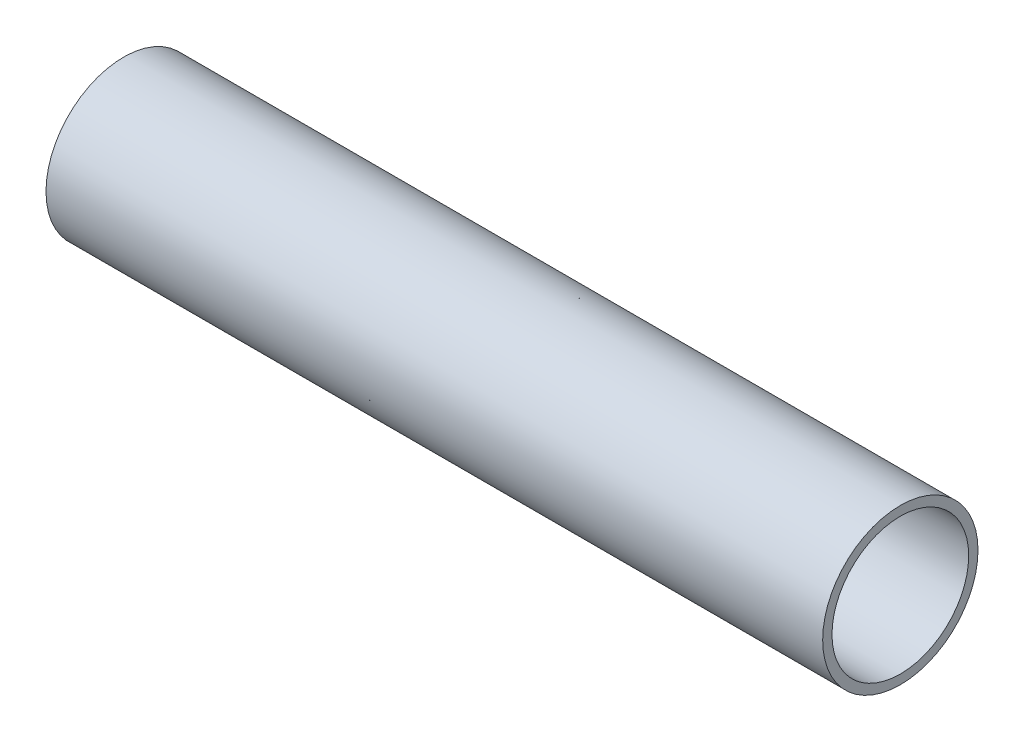
ISO-10303-21;
HEADER;
FILE_DESCRIPTION(('STEP AP214'),'2;1');
FILE_NAME('part.step','',(''),(''),'','','');
FILE_SCHEMA(('AUTOMOTIVE_DESIGN { 1 0 10303 214 1 1 1 1 }'));
ENDSEC;
DATA;
#1=APPLICATION_CONTEXT('core data for automotive mechanical design processes');
#2=APPLICATION_PROTOCOL_DEFINITION('international standard','automotive_design',2000,#1);
#3=PRODUCT_CONTEXT('',#1,'mechanical');
#4=PRODUCT('Part','Part','',(#3));
#5=PRODUCT_RELATED_PRODUCT_CATEGORY('part','',(#4));
#6=PRODUCT_DEFINITION_FORMATION('','',#4);
#7=PRODUCT_DEFINITION_CONTEXT('part definition',#1,'design');
#8=PRODUCT_DEFINITION('design','',#6,#7);
#9=PRODUCT_DEFINITION_SHAPE('','',#8);
#10=(LENGTH_UNIT() NAMED_UNIT(*) SI_UNIT(.MILLI.,.METRE.));
#11=(NAMED_UNIT(*) PLANE_ANGLE_UNIT() SI_UNIT($,.RADIAN.));
#12=(NAMED_UNIT(*) SI_UNIT($,.STERADIAN.) SOLID_ANGLE_UNIT());
#13=UNCERTAINTY_MEASURE_WITH_UNIT(LENGTH_MEASURE(1.E-05),#10,'distance_accuracy_value','');
#14=(GEOMETRIC_REPRESENTATION_CONTEXT(3) GLOBAL_UNCERTAINTY_ASSIGNED_CONTEXT((#13)) GLOBAL_UNIT_ASSIGNED_CONTEXT((#10,
#11,#12)) REPRESENTATION_CONTEXT('',''));
#15=CARTESIAN_POINT('',(0.,0.,0.));
#16=DIRECTION('',(0.,0.,1.));
#17=DIRECTION('',(1.,0.,0.));
#18=AXIS2_PLACEMENT_3D('',#15,#16,#17);
#19=CARTESIAN_POINT('',(125.,0.,0.));
#20=DIRECTION('',(1.,0.,0.));
#21=DIRECTION('',(0.,0.,-1.));
#22=AXIS2_PLACEMENT_3D('',#19,#20,#21);
#23=PLANE('',#22);
#24=CARTESIAN_POINT('',(125.,0.,0.));
#25=DIRECTION('',(1.,0.,0.));
#26=DIRECTION('',(0.,0.,-1.));
#27=AXIS2_PLACEMENT_3D('',#24,#25,#26);
#28=CIRCLE('',#27,25.);
#29=CARTESIAN_POINT('',(125.,0.,-25.));
#30=VERTEX_POINT('',#29);
#31=EDGE_CURVE('E10',#30,#30,#28,.T.);
#32=ORIENTED_EDGE('',*,*,#31,.T.);
#33=EDGE_LOOP('',(#32));
#34=FACE_BOUND('',#33,.T.);
#35=CARTESIAN_POINT('',(125.,0.,0.));
#36=DIRECTION('',(1.,0.,0.));
#37=DIRECTION('',(0.,0.,-1.));
#38=AXIS2_PLACEMENT_3D('',#35,#36,#37);
#39=CIRCLE('',#38,22.);
#40=CARTESIAN_POINT('',(125.,0.,-22.));
#41=VERTEX_POINT('',#40);
#42=EDGE_CURVE('E44',#41,#41,#39,.T.);
#43=ORIENTED_EDGE('',*,*,#42,.F.);
#44=EDGE_LOOP('',(#43));
#45=FACE_BOUND('',#44,.T.);
#46=ADVANCED_FACE('F37',(#34,#45),#23,.T.);
#47=CARTESIAN_POINT('',(125.,0.,0.));
#48=DIRECTION('',(-1.,0.,0.));
#49=DIRECTION('',(0.,0.,1.));
#50=AXIS2_PLACEMENT_3D('',#47,#48,#49);
#51=CYLINDRICAL_SURFACE('',#50,25.);
#52=ORIENTED_EDGE('',*,*,#31,.F.);
#53=EDGE_LOOP('',(#52));
#54=FACE_BOUND('',#53,.T.);
#55=CARTESIAN_POINT('',(-125.,0.,0.));
#56=DIRECTION('',(-1.,0.,0.));
#57=DIRECTION('',(0.,0.,1.));
#58=AXIS2_PLACEMENT_3D('',#55,#56,#57);
#59=CIRCLE('',#58,25.);
#60=CARTESIAN_POINT('',(-125.,0.,25.));
#61=VERTEX_POINT('',#60);
#62=EDGE_CURVE('E48',#61,#61,#59,.T.);
#63=ORIENTED_EDGE('',*,*,#62,.F.);
#64=EDGE_LOOP('',(#63));
#65=FACE_BOUND('',#64,.T.);
#66=ADVANCED_FACE('F39',(#54,#65),#51,.T.);
#67=CARTESIAN_POINT('',(125.,0.,0.));
#68=DIRECTION('',(-1.,0.,0.));
#69=DIRECTION('',(0.,0.,1.));
#70=AXIS2_PLACEMENT_3D('',#67,#68,#69);
#71=CYLINDRICAL_SURFACE('',#70,22.);
#72=ORIENTED_EDGE('',*,*,#42,.T.);
#73=EDGE_LOOP('',(#72));
#74=FACE_BOUND('',#73,.T.);
#75=CARTESIAN_POINT('',(-125.,0.,0.));
#76=DIRECTION('',(-1.,0.,0.));
#77=DIRECTION('',(0.,0.,1.));
#78=AXIS2_PLACEMENT_3D('',#75,#76,#77);
#79=CIRCLE('',#78,22.);
#80=CARTESIAN_POINT('',(-125.,0.,22.));
#81=VERTEX_POINT('',#80);
#82=EDGE_CURVE('E52',#81,#81,#79,.T.);
#83=ORIENTED_EDGE('',*,*,#82,.T.);
#84=EDGE_LOOP('',(#83));
#85=FACE_BOUND('',#84,.T.);
#86=ADVANCED_FACE('F58',(#74,#85),#71,.F.);
#87=CARTESIAN_POINT('',(-125.,0.,0.));
#88=DIRECTION('',(-1.,0.,0.));
#89=DIRECTION('',(0.,0.,1.));
#90=AXIS2_PLACEMENT_3D('',#87,#88,#89);
#91=PLANE('',#90);
#92=ORIENTED_EDGE('',*,*,#62,.T.);
#93=EDGE_LOOP('',(#92));
#94=FACE_BOUND('',#93,.T.);
#95=ORIENTED_EDGE('',*,*,#82,.F.);
#96=EDGE_LOOP('',(#95));
#97=FACE_BOUND('',#96,.T.);
#98=ADVANCED_FACE('F60',(#94,#97),#91,.T.);
#99=CLOSED_SHELL('',(#46,#66,#86,#98));
#100=MANIFOLD_SOLID_BREP('B2',#99);
#101=ADVANCED_BREP_SHAPE_REPRESENTATION('',(#18,#100),#14);
#102=SHAPE_DEFINITION_REPRESENTATION(#9,#101);
ENDSEC;
END-ISO-10303-21;
